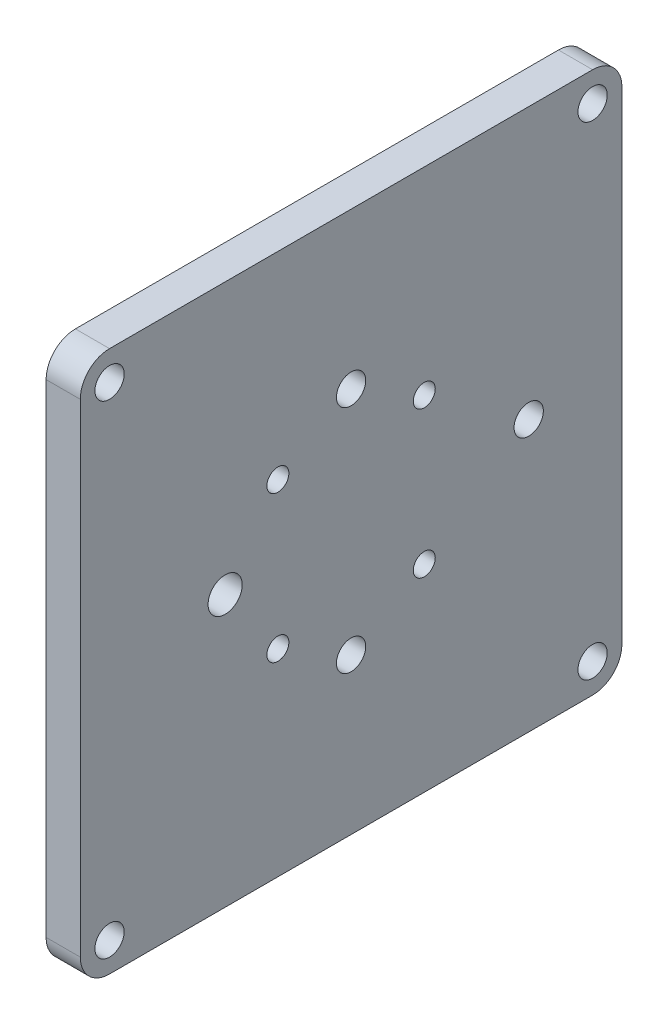
ISO-10303-21;
HEADER;
FILE_DESCRIPTION(('STEP AP214'),'2;1');
FILE_NAME('part.step','',(''),(''),'','','');
FILE_SCHEMA(('AUTOMOTIVE_DESIGN { 1 0 10303 214 1 1 1 1 }'));
ENDSEC;
DATA;
#1=APPLICATION_CONTEXT('core data for automotive mechanical design processes');
#2=APPLICATION_PROTOCOL_DEFINITION('international standard','automotive_design',2000,#1);
#3=PRODUCT_CONTEXT('',#1,'mechanical');
#4=PRODUCT('Part','Part','',(#3));
#5=PRODUCT_RELATED_PRODUCT_CATEGORY('part','',(#4));
#6=PRODUCT_DEFINITION_FORMATION('','',#4);
#7=PRODUCT_DEFINITION_CONTEXT('part definition',#1,'design');
#8=PRODUCT_DEFINITION('design','',#6,#7);
#9=PRODUCT_DEFINITION_SHAPE('','',#8);
#10=(LENGTH_UNIT() NAMED_UNIT(*) SI_UNIT(.MILLI.,.METRE.));
#11=(NAMED_UNIT(*) PLANE_ANGLE_UNIT() SI_UNIT($,.RADIAN.));
#12=(NAMED_UNIT(*) SI_UNIT($,.STERADIAN.) SOLID_ANGLE_UNIT());
#13=UNCERTAINTY_MEASURE_WITH_UNIT(LENGTH_MEASURE(1.E-05),#10,'distance_accuracy_value','');
#14=(GEOMETRIC_REPRESENTATION_CONTEXT(3) GLOBAL_UNCERTAINTY_ASSIGNED_CONTEXT((#13)) GLOBAL_UNIT_ASSIGNED_CONTEXT((#10,
#11,#12)) REPRESENTATION_CONTEXT('',''));
#15=CARTESIAN_POINT('',(0.,0.,0.));
#16=DIRECTION('',(0.,0.,1.));
#17=DIRECTION('',(1.,0.,0.));
#18=AXIS2_PLACEMENT_3D('',#15,#16,#17);
#19=CARTESIAN_POINT('',(-16.9705627484771,49.497474683058,-49.4974746830587));
#20=DIRECTION('',(1.,0.,0.));
#21=DIRECTION('',(0.,0.,-1.));
#22=AXIS2_PLACEMENT_3D('',#19,#20,#21);
#23=CYLINDRICAL_SURFACE('',#22,5.99999999999999);
#24=CARTESIAN_POINT('',(0.,49.497474683058,-49.4974746830587));
#25=DIRECTION('',(1.,0.,0.));
#26=DIRECTION('',(0.,0.,-1.));
#27=AXIS2_PLACEMENT_3D('',#24,#25,#26);
#28=CIRCLE('',#27,5.99999999999999);
#29=CARTESIAN_POINT('',(0.,55.497474683058,-49.4974746830587));
#30=VERTEX_POINT('',#29);
#31=CARTESIAN_POINT('',(0.,49.4974746830579,-55.4974746830587));
#32=VERTEX_POINT('',#31);
#33=EDGE_CURVE('E200',#30,#32,#28,.F.);
#34=ORIENTED_EDGE('',*,*,#33,.F.);
#35=DIRECTION('',(-1.,0.,0.));
#36=VECTOR('',#35,1.);
#37=CARTESIAN_POINT('',(112.5652235788,55.497474683058,-49.4974746830587));
#38=LINE('',#37,#36);
#39=CARTESIAN_POINT('',(7.00000000000002,55.497474683058,-49.4974746830587));
#40=VERTEX_POINT('',#39);
#41=EDGE_CURVE('E132',#40,#30,#38,.T.);
#42=ORIENTED_EDGE('',*,*,#41,.F.);
#43=CARTESIAN_POINT('',(7.00000000000001,49.497474683058,-49.4974746830587));
#44=DIRECTION('',(1.,0.,0.));
#45=DIRECTION('',(0.,0.,-1.));
#46=AXIS2_PLACEMENT_3D('',#43,#44,#45);
#47=CIRCLE('',#46,6.);
#48=CARTESIAN_POINT('',(6.99999999999999,49.4974746830579,-55.4974746830587));
#49=VERTEX_POINT('',#48);
#50=EDGE_CURVE('E127',#49,#40,#47,.T.);
#51=ORIENTED_EDGE('',*,*,#50,.F.);
#52=DIRECTION('',(-1.,0.,0.));
#53=VECTOR('',#52,1.);
#54=CARTESIAN_POINT('',(112.5652235788,49.4974746830579,-55.4974746830587));
#55=LINE('',#54,#53);
#56=EDGE_CURVE('E11',#49,#32,#55,.T.);
#57=ORIENTED_EDGE('',*,*,#56,.T.);
#58=EDGE_LOOP('',(#34,#42,#51,#57));
#59=FACE_BOUND('',#58,.T.);
#60=ADVANCED_FACE('F47',(#59),#23,.T.);
#61=CARTESIAN_POINT('',(-16.9705627484771,49.4974746830585,49.4974746830582));
#62=DIRECTION('',(1.,0.,0.));
#63=DIRECTION('',(0.,0.,-1.));
#64=AXIS2_PLACEMENT_3D('',#61,#62,#63);
#65=CYLINDRICAL_SURFACE('',#64,5.99999999999999);
#66=DIRECTION('',(-1.,0.,0.));
#67=VECTOR('',#66,1.);
#68=CARTESIAN_POINT('',(112.5652235788,49.4974746830585,55.4974746830581));
#69=LINE('',#68,#67);
#70=CARTESIAN_POINT('',(6.99999999999999,49.4974746830585,55.4974746830581));
#71=VERTEX_POINT('',#70);
#72=CARTESIAN_POINT('',(0.,49.4974746830585,55.4974746830581));
#73=VERTEX_POINT('',#72);
#74=EDGE_CURVE('E158',#71,#73,#69,.T.);
#75=ORIENTED_EDGE('',*,*,#74,.F.);
#76=CARTESIAN_POINT('',(7.00000000000001,49.4974746830585,49.4974746830582));
#77=DIRECTION('',(1.,0.,0.));
#78=DIRECTION('',(0.,0.,-1.));
#79=AXIS2_PLACEMENT_3D('',#76,#77,#78);
#80=CIRCLE('',#79,5.99999999999998);
#81=CARTESIAN_POINT('',(6.99999999999999,55.4974746830585,49.4974746830581));
#82=VERTEX_POINT('',#81);
#83=EDGE_CURVE('E131',#82,#71,#80,.T.);
#84=ORIENTED_EDGE('',*,*,#83,.F.);
#85=DIRECTION('',(-1.,0.,0.));
#86=VECTOR('',#85,1.);
#87=CARTESIAN_POINT('',(112.5652235788,55.4974746830585,49.4974746830581));
#88=LINE('',#87,#86);
#89=CARTESIAN_POINT('',(0.,55.4974746830585,49.4974746830581));
#90=VERTEX_POINT('',#89);
#91=EDGE_CURVE('E56',#82,#90,#88,.T.);
#92=ORIENTED_EDGE('',*,*,#91,.T.);
#93=CARTESIAN_POINT('',(0.,49.4974746830585,49.4974746830582));
#94=DIRECTION('',(1.,0.,0.));
#95=DIRECTION('',(0.,0.,-1.));
#96=AXIS2_PLACEMENT_3D('',#93,#94,#95);
#97=CIRCLE('',#96,5.99999999999999);
#98=EDGE_CURVE('E193',#73,#90,#97,.F.);
#99=ORIENTED_EDGE('',*,*,#98,.F.);
#100=EDGE_LOOP('',(#75,#84,#92,#99));
#101=FACE_BOUND('',#100,.T.);
#102=ADVANCED_FACE('F291',(#101),#65,.T.);
#103=CARTESIAN_POINT('',(-16.9705627484771,-49.4974746830583,49.4974746830583));
#104=DIRECTION('',(1.,0.,0.));
#105=DIRECTION('',(0.,0.,-1.));
#106=AXIS2_PLACEMENT_3D('',#103,#104,#105);
#107=CYLINDRICAL_SURFACE('',#106,5.99999999999999);
#108=DIRECTION('',(-1.,0.,0.));
#109=VECTOR('',#108,1.);
#110=CARTESIAN_POINT('',(112.5652235788,-55.4974746830583,49.4974746830583));
#111=LINE('',#110,#109);
#112=CARTESIAN_POINT('',(6.99999999999999,-55.4974746830583,49.4974746830583));
#113=VERTEX_POINT('',#112);
#114=CARTESIAN_POINT('',(0.,-55.4974746830583,49.4974746830583));
#115=VERTEX_POINT('',#114);
#116=EDGE_CURVE('E175',#113,#115,#111,.T.);
#117=ORIENTED_EDGE('',*,*,#116,.F.);
#118=CARTESIAN_POINT('',(7.00000000000001,-49.4974746830583,49.4974746830583));
#119=DIRECTION('',(1.,0.,0.));
#120=DIRECTION('',(0.,0.,-1.));
#121=AXIS2_PLACEMENT_3D('',#118,#119,#120);
#122=CIRCLE('',#121,6.);
#123=CARTESIAN_POINT('',(6.99999999999999,-49.4974746830583,55.4974746830583));
#124=VERTEX_POINT('',#123);
#125=EDGE_CURVE('E141',#124,#113,#122,.T.);
#126=ORIENTED_EDGE('',*,*,#125,.F.);
#127=DIRECTION('',(-1.,0.,0.));
#128=VECTOR('',#127,1.);
#129=CARTESIAN_POINT('',(112.5652235788,-49.4974746830583,55.4974746830583));
#130=LINE('',#129,#128);
#131=CARTESIAN_POINT('',(0.,-49.4974746830583,55.4974746830583));
#132=VERTEX_POINT('',#131);
#133=EDGE_CURVE('E164',#124,#132,#130,.T.);
#134=ORIENTED_EDGE('',*,*,#133,.T.);
#135=CARTESIAN_POINT('',(0.,-49.4974746830583,49.4974746830583));
#136=DIRECTION('',(1.,0.,0.));
#137=DIRECTION('',(0.,0.,-1.));
#138=AXIS2_PLACEMENT_3D('',#135,#136,#137);
#139=CIRCLE('',#138,5.99999999999999);
#140=EDGE_CURVE('E195',#115,#132,#139,.F.);
#141=ORIENTED_EDGE('',*,*,#140,.F.);
#142=EDGE_LOOP('',(#117,#126,#134,#141));
#143=FACE_BOUND('',#142,.T.);
#144=ADVANCED_FACE('F282',(#143),#107,.T.);
#145=CARTESIAN_POINT('',(-16.9705627484771,-49.4974746830588,-49.4974746830578));
#146=DIRECTION('',(1.,0.,0.));
#147=DIRECTION('',(0.,0.,-1.));
#148=AXIS2_PLACEMENT_3D('',#145,#146,#147);
#149=CYLINDRICAL_SURFACE('',#148,5.99999999999999);
#150=CARTESIAN_POINT('',(0.,-49.4974746830588,-49.4974746830578));
#151=DIRECTION('',(1.,0.,0.));
#152=DIRECTION('',(0.,0.,-1.));
#153=AXIS2_PLACEMENT_3D('',#150,#151,#152);
#154=CIRCLE('',#153,5.99999999999999);
#155=CARTESIAN_POINT('',(0.,-49.4974746830589,-55.4974746830578));
#156=VERTEX_POINT('',#155);
#157=CARTESIAN_POINT('',(0.,-55.4974746830588,-49.4974746830578));
#158=VERTEX_POINT('',#157);
#159=EDGE_CURVE('E189',#156,#158,#154,.F.);
#160=ORIENTED_EDGE('',*,*,#159,.F.);
#161=DIRECTION('',(-1.,0.,0.));
#162=VECTOR('',#161,1.);
#163=CARTESIAN_POINT('',(112.5652235788,-49.4974746830589,-55.4974746830578));
#164=LINE('',#163,#162);
#165=CARTESIAN_POINT('',(7.00000000000002,-49.4974746830589,-55.4974746830578));
#166=VERTEX_POINT('',#165);
#167=EDGE_CURVE('E128',#166,#156,#164,.T.);
#168=ORIENTED_EDGE('',*,*,#167,.F.);
#169=CARTESIAN_POINT('',(7.00000000000001,-49.4974746830588,-49.4974746830578));
#170=DIRECTION('',(1.,0.,0.));
#171=DIRECTION('',(0.,0.,-1.));
#172=AXIS2_PLACEMENT_3D('',#169,#170,#171);
#173=CIRCLE('',#172,5.99999999999998);
#174=CARTESIAN_POINT('',(6.99999999999999,-55.4974746830588,-49.4974746830578));
#175=VERTEX_POINT('',#174);
#176=EDGE_CURVE('E129',#175,#166,#173,.T.);
#177=ORIENTED_EDGE('',*,*,#176,.F.);
#178=DIRECTION('',(-1.,0.,0.));
#179=VECTOR('',#178,1.);
#180=CARTESIAN_POINT('',(112.5652235788,-55.4974746830588,-49.4974746830578));
#181=LINE('',#180,#179);
#182=EDGE_CURVE('E182',#175,#158,#181,.T.);
#183=ORIENTED_EDGE('',*,*,#182,.T.);
#184=EDGE_LOOP('',(#160,#168,#177,#183));
#185=FACE_BOUND('',#184,.T.);
#186=ADVANCED_FACE('F287',(#185),#149,.T.);
#187=CARTESIAN_POINT('',(0.,0.,25.8061469416127));
#188=DIRECTION('',(1.,0.,0.));
#189=DIRECTION('',(0.,0.,-1.));
#190=AXIS2_PLACEMENT_3D('',#187,#188,#189);
#191=PLANE('',#190);
#192=CARTESIAN_POINT('',(0.,15.,15.));
#193=DIRECTION('',(1.,0.,0.));
#194=DIRECTION('',(0.,0.,-1.));
#195=AXIS2_PLACEMENT_3D('',#192,#193,#194);
#196=CIRCLE('',#195,2.25);
#197=CARTESIAN_POINT('',(0.,15.,12.75));
#198=VERTEX_POINT('',#197);
#199=EDGE_CURVE('E138',#198,#198,#196,.F.);
#200=ORIENTED_EDGE('',*,*,#199,.F.);
#201=EDGE_LOOP('',(#200));
#202=FACE_BOUND('',#201,.T.);
#203=CARTESIAN_POINT('',(0.,-15.,15.));
#204=DIRECTION('',(1.,0.,0.));
#205=DIRECTION('',(0.,0.,-1.));
#206=AXIS2_PLACEMENT_3D('',#203,#204,#205);
#207=CIRCLE('',#206,2.25);
#208=CARTESIAN_POINT('',(0.,-15.,12.75));
#209=VERTEX_POINT('',#208);
#210=EDGE_CURVE('E256',#209,#209,#207,.F.);
#211=ORIENTED_EDGE('',*,*,#210,.F.);
#212=EDGE_LOOP('',(#211));
#213=FACE_BOUND('',#212,.T.);
#214=CARTESIAN_POINT('',(0.,15.,-15.));
#215=DIRECTION('',(1.,0.,0.));
#216=DIRECTION('',(0.,0.,-1.));
#217=AXIS2_PLACEMENT_3D('',#214,#215,#216);
#218=CIRCLE('',#217,2.25);
#219=CARTESIAN_POINT('',(0.,15.,-17.25));
#220=VERTEX_POINT('',#219);
#221=EDGE_CURVE('E253',#220,#220,#218,.F.);
#222=ORIENTED_EDGE('',*,*,#221,.F.);
#223=EDGE_LOOP('',(#222));
#224=FACE_BOUND('',#223,.T.);
#225=CARTESIAN_POINT('',(0.,23.6,0.));
#226=DIRECTION('',(1.,0.,0.));
#227=DIRECTION('',(0.,0.,-1.));
#228=AXIS2_PLACEMENT_3D('',#225,#226,#227);
#229=CIRCLE('',#228,3.);
#230=CARTESIAN_POINT('',(0.,23.6,-2.99999999999999));
#231=VERTEX_POINT('',#230);
#232=EDGE_CURVE('E252',#231,#231,#229,.F.);
#233=ORIENTED_EDGE('',*,*,#232,.F.);
#234=EDGE_LOOP('',(#233));
#235=FACE_BOUND('',#234,.T.);
#236=CARTESIAN_POINT('',(0.,0.,-36.4));
#237=DIRECTION('',(1.,0.,0.));
#238=DIRECTION('',(0.,0.,-1.));
#239=AXIS2_PLACEMENT_3D('',#236,#237,#238);
#240=CIRCLE('',#239,3.);
#241=CARTESIAN_POINT('',(0.,0.,-39.4));
#242=VERTEX_POINT('',#241);
#243=EDGE_CURVE('E246',#242,#242,#240,.F.);
#244=ORIENTED_EDGE('',*,*,#243,.F.);
#245=EDGE_LOOP('',(#244));
#246=FACE_BOUND('',#245,.T.);
#247=CARTESIAN_POINT('',(0.,-49.4974746830588,-49.4974746830578));
#248=DIRECTION('',(1.,0.,0.));
#249=DIRECTION('',(0.,0.,-1.));
#250=AXIS2_PLACEMENT_3D('',#247,#248,#249);
#251=CIRCLE('',#250,2.99999999999999);
#252=CARTESIAN_POINT('',(0.,-49.4974746830588,-52.4974746830578));
#253=VERTEX_POINT('',#252);
#254=EDGE_CURVE('E241',#253,#253,#251,.F.);
#255=ORIENTED_EDGE('',*,*,#254,.F.);
#256=EDGE_LOOP('',(#255));
#257=FACE_BOUND('',#256,.T.);
#258=CARTESIAN_POINT('',(0.,49.497474683058,-49.4974746830587));
#259=DIRECTION('',(1.,0.,0.));
#260=DIRECTION('',(0.,0.,-1.));
#261=AXIS2_PLACEMENT_3D('',#258,#259,#260);
#262=CIRCLE('',#261,2.99999999999999);
#263=CARTESIAN_POINT('',(0.,49.497474683058,-52.4974746830587));
#264=VERTEX_POINT('',#263);
#265=EDGE_CURVE('E236',#264,#264,#262,.F.);
#266=ORIENTED_EDGE('',*,*,#265,.F.);
#267=EDGE_LOOP('',(#266));
#268=FACE_BOUND('',#267,.T.);
#269=CARTESIAN_POINT('',(0.,49.4974746830585,49.4974746830582));
#270=DIRECTION('',(1.,0.,0.));
#271=DIRECTION('',(0.,0.,-1.));
#272=AXIS2_PLACEMENT_3D('',#269,#270,#271);
#273=CIRCLE('',#272,2.99999999999999);
#274=CARTESIAN_POINT('',(0.,49.4974746830585,46.4974746830582));
#275=VERTEX_POINT('',#274);
#276=EDGE_CURVE('E233',#275,#275,#273,.F.);
#277=ORIENTED_EDGE('',*,*,#276,.F.);
#278=EDGE_LOOP('',(#277));
#279=FACE_BOUND('',#278,.T.);
#280=CARTESIAN_POINT('',(0.,0.,25.8061469416127));
#281=DIRECTION('',(1.,0.,0.));
#282=DIRECTION('',(0.,0.,-1.));
#283=AXIS2_PLACEMENT_3D('',#280,#281,#282);
#284=CIRCLE('',#283,3.5);
#285=CARTESIAN_POINT('',(0.,0.,22.3061469416127));
#286=VERTEX_POINT('',#285);
#287=EDGE_CURVE('E227',#286,#286,#284,.F.);
#288=ORIENTED_EDGE('',*,*,#287,.F.);
#289=EDGE_LOOP('',(#288));
#290=FACE_BOUND('',#289,.T.);
#291=CARTESIAN_POINT('',(0.,-23.6,0.));
#292=DIRECTION('',(1.,0.,0.));
#293=DIRECTION('',(0.,0.,-1.));
#294=AXIS2_PLACEMENT_3D('',#291,#292,#293);
#295=CIRCLE('',#294,3.);
#296=CARTESIAN_POINT('',(0.,-23.6,-3.));
#297=VERTEX_POINT('',#296);
#298=EDGE_CURVE('E225',#297,#297,#295,.F.);
#299=ORIENTED_EDGE('',*,*,#298,.F.);
#300=EDGE_LOOP('',(#299));
#301=FACE_BOUND('',#300,.T.);
#302=CARTESIAN_POINT('',(0.,-15.,-15.));
#303=DIRECTION('',(1.,0.,0.));
#304=DIRECTION('',(0.,0.,-1.));
#305=AXIS2_PLACEMENT_3D('',#302,#303,#304);
#306=CIRCLE('',#305,2.25);
#307=CARTESIAN_POINT('',(0.,-15.,-17.25));
#308=VERTEX_POINT('',#307);
#309=EDGE_CURVE('E219',#308,#308,#306,.F.);
#310=ORIENTED_EDGE('',*,*,#309,.F.);
#311=EDGE_LOOP('',(#310));
#312=FACE_BOUND('',#311,.T.);
#313=CARTESIAN_POINT('',(0.,-49.4974746830583,49.4974746830583));
#314=DIRECTION('',(1.,0.,0.));
#315=DIRECTION('',(0.,0.,-1.));
#316=AXIS2_PLACEMENT_3D('',#313,#314,#315);
#317=CIRCLE('',#316,2.99999999999999);
#318=CARTESIAN_POINT('',(0.,-49.4974746830583,46.4974746830583));
#319=VERTEX_POINT('',#318);
#320=EDGE_CURVE('E215',#319,#319,#317,.F.);
#321=ORIENTED_EDGE('',*,*,#320,.F.);
#322=EDGE_LOOP('',(#321));
#323=FACE_BOUND('',#322,.T.);
#324=DIRECTION('',(0.,-1.,0.));
#325=VECTOR('',#324,1.);
#326=CARTESIAN_POINT('',(0.,49.4974746830579,-55.4974746830587));
#327=LINE('',#326,#325);
#328=EDGE_CURVE('E69',#32,#156,#327,.T.);
#329=ORIENTED_EDGE('',*,*,#328,.T.);
#330=ORIENTED_EDGE('',*,*,#159,.T.);
#331=DIRECTION('',(0.,0.,1.));
#332=VECTOR('',#331,1.);
#333=CARTESIAN_POINT('',(0.,-55.4974746830588,-49.4974746830578));
#334=LINE('',#333,#332);
#335=EDGE_CURVE('E177',#158,#115,#334,.T.);
#336=ORIENTED_EDGE('',*,*,#335,.T.);
#337=ORIENTED_EDGE('',*,*,#140,.T.);
#338=DIRECTION('',(0.,1.,0.));
#339=VECTOR('',#338,1.);
#340=CARTESIAN_POINT('',(0.,49.4974746830585,55.4974746830581));
#341=LINE('',#340,#339);
#342=EDGE_CURVE('E166',#132,#73,#341,.T.);
#343=ORIENTED_EDGE('',*,*,#342,.T.);
#344=ORIENTED_EDGE('',*,*,#98,.T.);
#345=DIRECTION('',(0.,0.,-1.));
#346=VECTOR('',#345,1.);
#347=CARTESIAN_POINT('',(0.,55.4974746830585,49.4974746830581));
#348=LINE('',#347,#346);
#349=EDGE_CURVE('E72',#90,#30,#348,.T.);
#350=ORIENTED_EDGE('',*,*,#349,.T.);
#351=ORIENTED_EDGE('',*,*,#33,.T.);
#352=EDGE_LOOP('',(#329,#330,#336,#337,#343,#344,#350,#351));
#353=FACE_BOUND('',#352,.T.);
#354=ADVANCED_FACE('F51',(#202,#213,#224,#235,#246,#257,#268,#279,#290,#301,#312,#323,#353),
#191,.F.);
#355=CARTESIAN_POINT('',(7.,-15.,15.));
#356=DIRECTION('',(1.,0.,0.));
#357=DIRECTION('',(0.,0.,-1.));
#358=AXIS2_PLACEMENT_3D('',#355,#356,#357);
#359=PLANE('',#358);
#360=CARTESIAN_POINT('',(7.00000000000001,15.,15.));
#361=DIRECTION('',(1.,0.,0.));
#362=DIRECTION('',(0.,0.,-1.));
#363=AXIS2_PLACEMENT_3D('',#360,#361,#362);
#364=CIRCLE('',#363,2.25);
#365=CARTESIAN_POINT('',(7.00000000000001,15.,12.75));
#366=VERTEX_POINT('',#365);
#367=EDGE_CURVE('E52',#366,#366,#364,.F.);
#368=ORIENTED_EDGE('',*,*,#367,.T.);
#369=EDGE_LOOP('',(#368));
#370=FACE_BOUND('',#369,.T.);
#371=CARTESIAN_POINT('',(7.00000000000001,-15.,15.));
#372=DIRECTION('',(1.,0.,0.));
#373=DIRECTION('',(0.,0.,-1.));
#374=AXIS2_PLACEMENT_3D('',#371,#372,#373);
#375=CIRCLE('',#374,2.25);
#376=CARTESIAN_POINT('',(7.00000000000001,-15.,12.75));
#377=VERTEX_POINT('',#376);
#378=EDGE_CURVE('E257',#377,#377,#375,.F.);
#379=ORIENTED_EDGE('',*,*,#378,.T.);
#380=EDGE_LOOP('',(#379));
#381=FACE_BOUND('',#380,.T.);
#382=CARTESIAN_POINT('',(7.00000000000001,15.,-15.));
#383=DIRECTION('',(1.,0.,0.));
#384=DIRECTION('',(0.,0.,-1.));
#385=AXIS2_PLACEMENT_3D('',#382,#383,#384);
#386=CIRCLE('',#385,2.25);
#387=CARTESIAN_POINT('',(7.00000000000001,15.,-17.25));
#388=VERTEX_POINT('',#387);
#389=EDGE_CURVE('E255',#388,#388,#386,.F.);
#390=ORIENTED_EDGE('',*,*,#389,.T.);
#391=EDGE_LOOP('',(#390));
#392=FACE_BOUND('',#391,.T.);
#393=CARTESIAN_POINT('',(7.00000000000001,23.6,0.));
#394=DIRECTION('',(1.,0.,0.));
#395=DIRECTION('',(0.,0.,-1.));
#396=AXIS2_PLACEMENT_3D('',#393,#394,#395);
#397=CIRCLE('',#396,3.);
#398=CARTESIAN_POINT('',(7.00000000000001,23.6,-2.99999999999999));
#399=VERTEX_POINT('',#398);
#400=EDGE_CURVE('E250',#399,#399,#397,.F.);
#401=ORIENTED_EDGE('',*,*,#400,.T.);
#402=EDGE_LOOP('',(#401));
#403=FACE_BOUND('',#402,.T.);
#404=CARTESIAN_POINT('',(7.00000000000001,0.,-36.4));
#405=DIRECTION('',(1.,0.,0.));
#406=DIRECTION('',(0.,0.,-1.));
#407=AXIS2_PLACEMENT_3D('',#404,#405,#406);
#408=CIRCLE('',#407,3.);
#409=CARTESIAN_POINT('',(7.00000000000001,0.,-39.4));
#410=VERTEX_POINT('',#409);
#411=EDGE_CURVE('E245',#410,#410,#408,.F.);
#412=ORIENTED_EDGE('',*,*,#411,.T.);
#413=EDGE_LOOP('',(#412));
#414=FACE_BOUND('',#413,.T.);
#415=CARTESIAN_POINT('',(7.00000000000001,-49.4974746830588,-49.4974746830578));
#416=DIRECTION('',(1.,0.,0.));
#417=DIRECTION('',(0.,0.,-1.));
#418=AXIS2_PLACEMENT_3D('',#415,#416,#417);
#419=CIRCLE('',#418,2.99999999999999);
#420=CARTESIAN_POINT('',(7.00000000000001,-49.4974746830588,-52.4974746830578));
#421=VERTEX_POINT('',#420);
#422=EDGE_CURVE('E240',#421,#421,#419,.F.);
#423=ORIENTED_EDGE('',*,*,#422,.T.);
#424=EDGE_LOOP('',(#423));
#425=FACE_BOUND('',#424,.T.);
#426=CARTESIAN_POINT('',(7.00000000000001,49.497474683058,-49.4974746830587));
#427=DIRECTION('',(1.,0.,0.));
#428=DIRECTION('',(0.,0.,-1.));
#429=AXIS2_PLACEMENT_3D('',#426,#427,#428);
#430=CIRCLE('',#429,2.99999999999999);
#431=CARTESIAN_POINT('',(7.00000000000001,49.497474683058,-52.4974746830587));
#432=VERTEX_POINT('',#431);
#433=EDGE_CURVE('E235',#432,#432,#430,.F.);
#434=ORIENTED_EDGE('',*,*,#433,.T.);
#435=EDGE_LOOP('',(#434));
#436=FACE_BOUND('',#435,.T.);
#437=CARTESIAN_POINT('',(7.00000000000001,49.4974746830585,49.4974746830582));
#438=DIRECTION('',(1.,0.,0.));
#439=DIRECTION('',(0.,0.,-1.));
#440=AXIS2_PLACEMENT_3D('',#437,#438,#439);
#441=CIRCLE('',#440,2.99999999999999);
#442=CARTESIAN_POINT('',(7.00000000000001,49.4974746830585,46.4974746830582));
#443=VERTEX_POINT('',#442);
#444=EDGE_CURVE('E226',#443,#443,#441,.F.);
#445=ORIENTED_EDGE('',*,*,#444,.T.);
#446=EDGE_LOOP('',(#445));
#447=FACE_BOUND('',#446,.T.);
#448=CARTESIAN_POINT('',(7.00000000000001,0.,25.8061469416127));
#449=DIRECTION('',(1.,0.,0.));
#450=DIRECTION('',(0.,0.,-1.));
#451=AXIS2_PLACEMENT_3D('',#448,#449,#450);
#452=CIRCLE('',#451,3.5);
#453=CARTESIAN_POINT('',(7.00000000000001,0.,22.3061469416127));
#454=VERTEX_POINT('',#453);
#455=EDGE_CURVE('E221',#454,#454,#452,.F.);
#456=ORIENTED_EDGE('',*,*,#455,.T.);
#457=EDGE_LOOP('',(#456));
#458=FACE_BOUND('',#457,.T.);
#459=CARTESIAN_POINT('',(7.00000000000001,-23.6,0.));
#460=DIRECTION('',(1.,0.,0.));
#461=DIRECTION('',(0.,0.,-1.));
#462=AXIS2_PLACEMENT_3D('',#459,#460,#461);
#463=CIRCLE('',#462,3.);
#464=CARTESIAN_POINT('',(7.00000000000001,-23.6,-3.));
#465=VERTEX_POINT('',#464);
#466=EDGE_CURVE('E217',#465,#465,#463,.F.);
#467=ORIENTED_EDGE('',*,*,#466,.T.);
#468=EDGE_LOOP('',(#467));
#469=FACE_BOUND('',#468,.T.);
#470=CARTESIAN_POINT('',(7.00000000000001,-15.,-15.));
#471=DIRECTION('',(1.,0.,0.));
#472=DIRECTION('',(0.,0.,-1.));
#473=AXIS2_PLACEMENT_3D('',#470,#471,#472);
#474=CIRCLE('',#473,2.25);
#475=CARTESIAN_POINT('',(7.00000000000001,-15.,-17.25));
#476=VERTEX_POINT('',#475);
#477=EDGE_CURVE('E214',#476,#476,#474,.F.);
#478=ORIENTED_EDGE('',*,*,#477,.T.);
#479=EDGE_LOOP('',(#478));
#480=FACE_BOUND('',#479,.T.);
#481=CARTESIAN_POINT('',(7.00000000000001,-49.4974746830583,49.4974746830583));
#482=DIRECTION('',(1.,0.,0.));
#483=DIRECTION('',(0.,0.,-1.));
#484=AXIS2_PLACEMENT_3D('',#481,#482,#483);
#485=CIRCLE('',#484,2.99999999999999);
#486=CARTESIAN_POINT('',(7.00000000000001,-49.4974746830583,46.4974746830583));
#487=VERTEX_POINT('',#486);
#488=EDGE_CURVE('E206',#487,#487,#485,.F.);
#489=ORIENTED_EDGE('',*,*,#488,.T.);
#490=EDGE_LOOP('',(#489));
#491=FACE_BOUND('',#490,.T.);
#492=DIRECTION('',(0.,1.,0.));
#493=VECTOR('',#492,1.);
#494=CARTESIAN_POINT('',(6.99999999999999,49.4974746830585,55.4974746830581));
#495=LINE('',#494,#493);
#496=EDGE_CURVE('E165',#124,#71,#495,.T.);
#497=ORIENTED_EDGE('',*,*,#496,.F.);
#498=ORIENTED_EDGE('',*,*,#125,.T.);
#499=DIRECTION('',(0.,0.,1.));
#500=VECTOR('',#499,1.);
#501=CARTESIAN_POINT('',(6.99999999999999,-55.4974746830588,-49.4974746830578));
#502=LINE('',#501,#500);
#503=EDGE_CURVE('E183',#175,#113,#502,.T.);
#504=ORIENTED_EDGE('',*,*,#503,.F.);
#505=ORIENTED_EDGE('',*,*,#176,.T.);
#506=DIRECTION('',(0.,-1.,0.));
#507=VECTOR('',#506,1.);
#508=CARTESIAN_POINT('',(6.99999999999999,49.4974746830579,-55.4974746830587));
#509=LINE('',#508,#507);
#510=EDGE_CURVE('E114',#49,#166,#509,.T.);
#511=ORIENTED_EDGE('',*,*,#510,.F.);
#512=ORIENTED_EDGE('',*,*,#50,.T.);
#513=DIRECTION('',(0.,0.,-1.));
#514=VECTOR('',#513,1.);
#515=CARTESIAN_POINT('',(6.99999999999999,55.4974746830585,49.4974746830581));
#516=LINE('',#515,#514);
#517=EDGE_CURVE('E157',#82,#40,#516,.T.);
#518=ORIENTED_EDGE('',*,*,#517,.F.);
#519=ORIENTED_EDGE('',*,*,#83,.T.);
#520=EDGE_LOOP('',(#497,#498,#504,#505,#511,#512,#518,#519));
#521=FACE_BOUND('',#520,.T.);
#522=ADVANCED_FACE('F121',(#370,#381,#392,#403,#414,#425,#436,#447,#458,#469,#480,#491,#521),
#359,.T.);
#523=CARTESIAN_POINT('',(112.5652235788,-55.4974746830588,-49.4974746830578));
#524=DIRECTION('',(0.,-1.,0.));
#525=DIRECTION('',(0.,0.,-1.));
#526=AXIS2_PLACEMENT_3D('',#523,#524,#525);
#527=PLANE('',#526);
#528=ORIENTED_EDGE('',*,*,#335,.F.);
#529=ORIENTED_EDGE('',*,*,#182,.F.);
#530=ORIENTED_EDGE('',*,*,#503,.T.);
#531=ORIENTED_EDGE('',*,*,#116,.T.);
#532=EDGE_LOOP('',(#528,#529,#530,#531));
#533=FACE_BOUND('',#532,.T.);
#534=ADVANCED_FACE('F288',(#533),#527,.T.);
#535=CARTESIAN_POINT('',(112.5652235788,49.4974746830585,55.4974746830581));
#536=DIRECTION('',(0.,0.,1.));
#537=DIRECTION('',(0.,-1.,0.));
#538=AXIS2_PLACEMENT_3D('',#535,#536,#537);
#539=PLANE('',#538);
#540=ORIENTED_EDGE('',*,*,#342,.F.);
#541=ORIENTED_EDGE('',*,*,#133,.F.);
#542=ORIENTED_EDGE('',*,*,#496,.T.);
#543=ORIENTED_EDGE('',*,*,#74,.T.);
#544=EDGE_LOOP('',(#540,#541,#542,#543));
#545=FACE_BOUND('',#544,.T.);
#546=ADVANCED_FACE('F298',(#545),#539,.T.);
#547=CARTESIAN_POINT('',(112.5652235788,55.4974746830585,49.4974746830581));
#548=DIRECTION('',(0.,1.,0.));
#549=DIRECTION('',(0.,0.,1.));
#550=AXIS2_PLACEMENT_3D('',#547,#548,#549);
#551=PLANE('',#550);
#552=ORIENTED_EDGE('',*,*,#91,.F.);
#553=ORIENTED_EDGE('',*,*,#517,.T.);
#554=ORIENTED_EDGE('',*,*,#41,.T.);
#555=ORIENTED_EDGE('',*,*,#349,.F.);
#556=EDGE_LOOP('',(#552,#553,#554,#555));
#557=FACE_BOUND('',#556,.T.);
#558=ADVANCED_FACE('F300',(#557),#551,.T.);
#559=CARTESIAN_POINT('',(112.5652235788,49.4974746830579,-55.4974746830587));
#560=DIRECTION('',(0.,0.,-1.));
#561=DIRECTION('',(0.,1.,0.));
#562=AXIS2_PLACEMENT_3D('',#559,#560,#561);
#563=PLANE('',#562);
#564=ORIENTED_EDGE('',*,*,#56,.F.);
#565=ORIENTED_EDGE('',*,*,#510,.T.);
#566=ORIENTED_EDGE('',*,*,#167,.T.);
#567=ORIENTED_EDGE('',*,*,#328,.F.);
#568=EDGE_LOOP('',(#564,#565,#566,#567));
#569=FACE_BOUND('',#568,.T.);
#570=ADVANCED_FACE('F112',(#569),#563,.T.);
#571=CARTESIAN_POINT('',(-196.,-49.4974746830583,49.4974746830583));
#572=DIRECTION('',(1.,0.,0.));
#573=DIRECTION('',(0.,0.,-1.));
#574=AXIS2_PLACEMENT_3D('',#571,#572,#573);
#575=CYLINDRICAL_SURFACE('',#574,2.99999999999999);
#576=ORIENTED_EDGE('',*,*,#488,.F.);
#577=EDGE_LOOP('',(#576));
#578=FACE_BOUND('',#577,.T.);
#579=ORIENTED_EDGE('',*,*,#320,.T.);
#580=EDGE_LOOP('',(#579));
#581=FACE_BOUND('',#580,.T.);
#582=ADVANCED_FACE('F303',(#578,#581),#575,.F.);
#583=CARTESIAN_POINT('',(-196.,-15.,-15.));
#584=DIRECTION('',(1.,0.,0.));
#585=DIRECTION('',(0.,0.,-1.));
#586=AXIS2_PLACEMENT_3D('',#583,#584,#585);
#587=CYLINDRICAL_SURFACE('',#586,2.25);
#588=ORIENTED_EDGE('',*,*,#477,.F.);
#589=EDGE_LOOP('',(#588));
#590=FACE_BOUND('',#589,.T.);
#591=ORIENTED_EDGE('',*,*,#309,.T.);
#592=EDGE_LOOP('',(#591));
#593=FACE_BOUND('',#592,.T.);
#594=ADVANCED_FACE('F349',(#590,#593),#587,.F.);
#595=CARTESIAN_POINT('',(-196.,-23.6,0.));
#596=DIRECTION('',(1.,0.,0.));
#597=DIRECTION('',(0.,0.,-1.));
#598=AXIS2_PLACEMENT_3D('',#595,#596,#597);
#599=CYLINDRICAL_SURFACE('',#598,3.);
#600=ORIENTED_EDGE('',*,*,#466,.F.);
#601=EDGE_LOOP('',(#600));
#602=FACE_BOUND('',#601,.T.);
#603=ORIENTED_EDGE('',*,*,#298,.T.);
#604=EDGE_LOOP('',(#603));
#605=FACE_BOUND('',#604,.T.);
#606=ADVANCED_FACE('F392',(#602,#605),#599,.F.);
#607=CARTESIAN_POINT('',(-196.,0.,25.8061469416127));
#608=DIRECTION('',(1.,0.,0.));
#609=DIRECTION('',(0.,0.,-1.));
#610=AXIS2_PLACEMENT_3D('',#607,#608,#609);
#611=CYLINDRICAL_SURFACE('',#610,3.5);
#612=ORIENTED_EDGE('',*,*,#455,.F.);
#613=EDGE_LOOP('',(#612));
#614=FACE_BOUND('',#613,.T.);
#615=ORIENTED_EDGE('',*,*,#287,.T.);
#616=EDGE_LOOP('',(#615));
#617=FACE_BOUND('',#616,.T.);
#618=ADVANCED_FACE('F396',(#614,#617),#611,.F.);
#619=CARTESIAN_POINT('',(-196.,49.4974746830585,49.4974746830582));
#620=DIRECTION('',(1.,0.,0.));
#621=DIRECTION('',(0.,0.,-1.));
#622=AXIS2_PLACEMENT_3D('',#619,#620,#621);
#623=CYLINDRICAL_SURFACE('',#622,2.99999999999999);
#624=ORIENTED_EDGE('',*,*,#444,.F.);
#625=EDGE_LOOP('',(#624));
#626=FACE_BOUND('',#625,.T.);
#627=ORIENTED_EDGE('',*,*,#276,.T.);
#628=EDGE_LOOP('',(#627));
#629=FACE_BOUND('',#628,.T.);
#630=ADVANCED_FACE('F417',(#626,#629),#623,.F.);
#631=CARTESIAN_POINT('',(-196.,49.497474683058,-49.4974746830587));
#632=DIRECTION('',(1.,0.,0.));
#633=DIRECTION('',(0.,0.,-1.));
#634=AXIS2_PLACEMENT_3D('',#631,#632,#633);
#635=CYLINDRICAL_SURFACE('',#634,2.99999999999999);
#636=ORIENTED_EDGE('',*,*,#433,.F.);
#637=EDGE_LOOP('',(#636));
#638=FACE_BOUND('',#637,.T.);
#639=ORIENTED_EDGE('',*,*,#265,.T.);
#640=EDGE_LOOP('',(#639));
#641=FACE_BOUND('',#640,.T.);
#642=ADVANCED_FACE('F422',(#638,#641),#635,.F.);
#643=CARTESIAN_POINT('',(-196.,-49.4974746830588,-49.4974746830578));
#644=DIRECTION('',(1.,0.,0.));
#645=DIRECTION('',(0.,0.,-1.));
#646=AXIS2_PLACEMENT_3D('',#643,#644,#645);
#647=CYLINDRICAL_SURFACE('',#646,2.99999999999999);
#648=ORIENTED_EDGE('',*,*,#422,.F.);
#649=EDGE_LOOP('',(#648));
#650=FACE_BOUND('',#649,.T.);
#651=ORIENTED_EDGE('',*,*,#254,.T.);
#652=EDGE_LOOP('',(#651));
#653=FACE_BOUND('',#652,.T.);
#654=ADVANCED_FACE('F428',(#650,#653),#647,.F.);
#655=CARTESIAN_POINT('',(-196.,0.,-36.4));
#656=DIRECTION('',(1.,0.,0.));
#657=DIRECTION('',(0.,0.,-1.));
#658=AXIS2_PLACEMENT_3D('',#655,#656,#657);
#659=CYLINDRICAL_SURFACE('',#658,3.);
#660=ORIENTED_EDGE('',*,*,#411,.F.);
#661=EDGE_LOOP('',(#660));
#662=FACE_BOUND('',#661,.T.);
#663=ORIENTED_EDGE('',*,*,#243,.T.);
#664=EDGE_LOOP('',(#663));
#665=FACE_BOUND('',#664,.T.);
#666=ADVANCED_FACE('F380',(#662,#665),#659,.F.);
#667=CARTESIAN_POINT('',(-196.,23.6,0.));
#668=DIRECTION('',(1.,0.,0.));
#669=DIRECTION('',(0.,0.,-1.));
#670=AXIS2_PLACEMENT_3D('',#667,#668,#669);
#671=CYLINDRICAL_SURFACE('',#670,3.);
#672=ORIENTED_EDGE('',*,*,#400,.F.);
#673=EDGE_LOOP('',(#672));
#674=FACE_BOUND('',#673,.T.);
#675=ORIENTED_EDGE('',*,*,#232,.T.);
#676=EDGE_LOOP('',(#675));
#677=FACE_BOUND('',#676,.T.);
#678=ADVANCED_FACE('F401',(#674,#677),#671,.F.);
#679=CARTESIAN_POINT('',(-196.,15.,-15.));
#680=DIRECTION('',(1.,0.,0.));
#681=DIRECTION('',(0.,0.,-1.));
#682=AXIS2_PLACEMENT_3D('',#679,#680,#681);
#683=CYLINDRICAL_SURFACE('',#682,2.25);
#684=ORIENTED_EDGE('',*,*,#389,.F.);
#685=EDGE_LOOP('',(#684));
#686=FACE_BOUND('',#685,.T.);
#687=ORIENTED_EDGE('',*,*,#221,.T.);
#688=EDGE_LOOP('',(#687));
#689=FACE_BOUND('',#688,.T.);
#690=ADVANCED_FACE('F407',(#686,#689),#683,.F.);
#691=CARTESIAN_POINT('',(-196.,-15.,15.));
#692=DIRECTION('',(1.,0.,0.));
#693=DIRECTION('',(0.,0.,-1.));
#694=AXIS2_PLACEMENT_3D('',#691,#692,#693);
#695=CYLINDRICAL_SURFACE('',#694,2.25);
#696=ORIENTED_EDGE('',*,*,#378,.F.);
#697=EDGE_LOOP('',(#696));
#698=FACE_BOUND('',#697,.T.);
#699=ORIENTED_EDGE('',*,*,#210,.T.);
#700=EDGE_LOOP('',(#699));
#701=FACE_BOUND('',#700,.T.);
#702=ADVANCED_FACE('F408',(#698,#701),#695,.F.);
#703=CARTESIAN_POINT('',(-196.,15.,15.));
#704=DIRECTION('',(1.,0.,0.));
#705=DIRECTION('',(0.,0.,-1.));
#706=AXIS2_PLACEMENT_3D('',#703,#704,#705);
#707=CYLINDRICAL_SURFACE('',#706,2.25);
#708=ORIENTED_EDGE('',*,*,#367,.F.);
#709=EDGE_LOOP('',(#708));
#710=FACE_BOUND('',#709,.T.);
#711=ORIENTED_EDGE('',*,*,#199,.T.);
#712=EDGE_LOOP('',(#711));
#713=FACE_BOUND('',#712,.T.);
#714=ADVANCED_FACE('F415',(#710,#713),#707,.F.);
#715=CLOSED_SHELL('',(#60,#102,#144,#186,#354,#522,#534,#546,#558,#570,#582,#594,#606,#618,#630,
#642,#654,#666,#678,#690,#702,#714));
#716=MANIFOLD_SOLID_BREP('B2',#715);
#717=ADVANCED_BREP_SHAPE_REPRESENTATION('',(#18,#716),#14);
#718=SHAPE_DEFINITION_REPRESENTATION(#9,#717);
ENDSEC;
END-ISO-10303-21;
